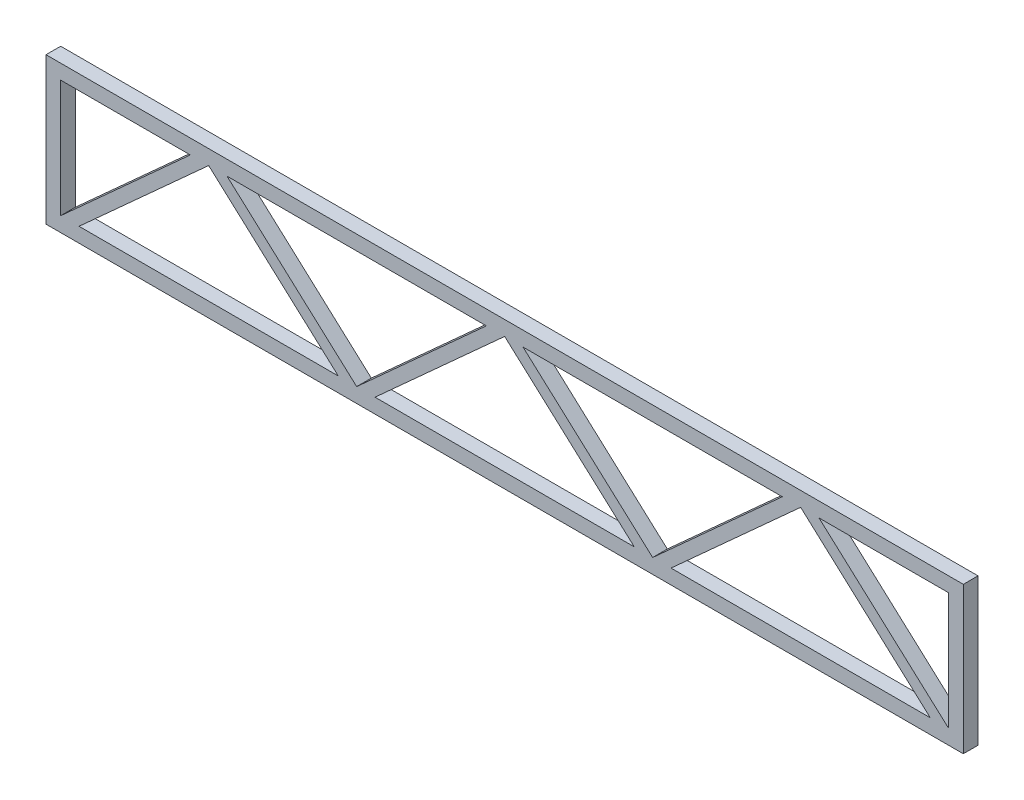
ISO-10303-21;
HEADER;
FILE_DESCRIPTION(('STEP AP214'),'2;1');
FILE_NAME('part.step','',(''),(''),'','','');
FILE_SCHEMA(('AUTOMOTIVE_DESIGN { 1 0 10303 214 1 1 1 1 }'));
ENDSEC;
DATA;
#1=APPLICATION_CONTEXT('core data for automotive mechanical design processes');
#2=APPLICATION_PROTOCOL_DEFINITION('international standard','automotive_design',2000,#1);
#3=PRODUCT_CONTEXT('',#1,'mechanical');
#4=PRODUCT('Part','Part','',(#3));
#5=PRODUCT_RELATED_PRODUCT_CATEGORY('part','',(#4));
#6=PRODUCT_DEFINITION_FORMATION('','',#4);
#7=PRODUCT_DEFINITION_CONTEXT('part definition',#1,'design');
#8=PRODUCT_DEFINITION('design','',#6,#7);
#9=PRODUCT_DEFINITION_SHAPE('','',#8);
#10=(LENGTH_UNIT() NAMED_UNIT(*) SI_UNIT(.MILLI.,.METRE.));
#11=(NAMED_UNIT(*) PLANE_ANGLE_UNIT() SI_UNIT($,.RADIAN.));
#12=(NAMED_UNIT(*) SI_UNIT($,.STERADIAN.) SOLID_ANGLE_UNIT());
#13=UNCERTAINTY_MEASURE_WITH_UNIT(LENGTH_MEASURE(1.E-05),#10,'distance_accuracy_value','');
#14=(GEOMETRIC_REPRESENTATION_CONTEXT(3) GLOBAL_UNCERTAINTY_ASSIGNED_CONTEXT((#13)) GLOBAL_UNIT_ASSIGNED_CONTEXT((#10,
#11,#12)) REPRESENTATION_CONTEXT('',''));
#15=CARTESIAN_POINT('',(0.,0.,0.));
#16=DIRECTION('',(0.,0.,1.));
#17=DIRECTION('',(1.,0.,0.));
#18=AXIS2_PLACEMENT_3D('',#15,#16,#17);
#19=CARTESIAN_POINT('',(125.,0.,3.99999999999999));
#20=DIRECTION('',(1.,0.,0.));
#21=DIRECTION('',(0.,1.,0.));
#22=AXIS2_PLACEMENT_3D('',#19,#20,#21);
#23=PLANE('',#22);
#24=DIRECTION('',(0.,-0.999999999999993,0.));
#25=VECTOR('',#24,1.);
#26=CARTESIAN_POINT('',(125.,0.,0.));
#27=LINE('',#26,#25);
#28=CARTESIAN_POINT('',(125.,20.,0.));
#29=VERTEX_POINT('',#28);
#30=CARTESIAN_POINT('',(125.,-20.,0.));
#31=VERTEX_POINT('',#30);
#32=EDGE_CURVE('E295',#29,#31,#27,.T.);
#33=ORIENTED_EDGE('',*,*,#32,.F.);
#34=DIRECTION('',(0.,0.,-1.));
#35=VECTOR('',#34,1.);
#36=CARTESIAN_POINT('',(125.,20.,3.99999999999999));
#37=LINE('',#36,#35);
#38=CARTESIAN_POINT('',(125.,20.,3.99999999999999));
#39=VERTEX_POINT('',#38);
#40=EDGE_CURVE('E11',#39,#29,#37,.T.);
#41=ORIENTED_EDGE('',*,*,#40,.F.);
#42=DIRECTION('',(0.,-0.999999999999993,0.));
#43=VECTOR('',#42,1.);
#44=CARTESIAN_POINT('',(125.,0.,3.99999999999999));
#45=LINE('',#44,#43);
#46=CARTESIAN_POINT('',(125.,-20.,4.));
#47=VERTEX_POINT('',#46);
#48=EDGE_CURVE('E236',#39,#47,#45,.T.);
#49=ORIENTED_EDGE('',*,*,#48,.T.);
#50=DIRECTION('',(0.,0.,-1.));
#51=VECTOR('',#50,1.);
#52=CARTESIAN_POINT('',(125.,-20.,4.));
#53=LINE('',#52,#51);
#54=EDGE_CURVE('E146',#47,#31,#53,.T.);
#55=ORIENTED_EDGE('',*,*,#54,.T.);
#56=EDGE_LOOP('',(#33,#41,#49,#55));
#57=FACE_BOUND('',#56,.T.);
#58=ADVANCED_FACE('F41',(#57),#23,.T.);
#59=CARTESIAN_POINT('',(0.,20.,4.00000000000001));
#60=DIRECTION('',(0.,1.,0.));
#61=DIRECTION('',(-1.,0.,0.));
#62=AXIS2_PLACEMENT_3D('',#59,#60,#61);
#63=PLANE('',#62);
#64=DIRECTION('',(0.999999999999998,0.,0.));
#65=VECTOR('',#64,1.);
#66=CARTESIAN_POINT('',(0.,20.,0.));
#67=LINE('',#66,#65);
#68=CARTESIAN_POINT('',(-125.,20.,0.));
#69=VERTEX_POINT('',#68);
#70=EDGE_CURVE('E226',#69,#29,#67,.T.);
#71=ORIENTED_EDGE('',*,*,#70,.F.);
#72=DIRECTION('',(0.,0.,-1.));
#73=VECTOR('',#72,1.);
#74=CARTESIAN_POINT('',(-125.,20.,4.));
#75=LINE('',#74,#73);
#76=CARTESIAN_POINT('',(-125.,20.,4.));
#77=VERTEX_POINT('',#76);
#78=EDGE_CURVE('E51',#77,#69,#75,.T.);
#79=ORIENTED_EDGE('',*,*,#78,.F.);
#80=DIRECTION('',(0.999999999999998,0.,0.));
#81=VECTOR('',#80,1.);
#82=CARTESIAN_POINT('',(0.,20.,4.00000000000001));
#83=LINE('',#82,#81);
#84=EDGE_CURVE('E224',#77,#39,#83,.T.);
#85=ORIENTED_EDGE('',*,*,#84,.T.);
#86=ORIENTED_EDGE('',*,*,#40,.T.);
#87=EDGE_LOOP('',(#71,#79,#85,#86));
#88=FACE_BOUND('',#87,.T.);
#89=ADVANCED_FACE('F222',(#88),#63,.T.);
#90=CARTESIAN_POINT('',(-125.,0.,4.));
#91=DIRECTION('',(1.,0.,0.));
#92=DIRECTION('',(0.,1.,0.));
#93=AXIS2_PLACEMENT_3D('',#90,#91,#92);
#94=PLANE('',#93);
#95=DIRECTION('',(0.,-0.999999999999993,0.));
#96=VECTOR('',#95,1.);
#97=CARTESIAN_POINT('',(-125.,0.,0.));
#98=LINE('',#97,#96);
#99=CARTESIAN_POINT('',(-125.,-20.,0.));
#100=VERTEX_POINT('',#99);
#101=EDGE_CURVE('E298',#69,#100,#98,.T.);
#102=ORIENTED_EDGE('',*,*,#101,.T.);
#103=DIRECTION('',(0.,0.,-1.));
#104=VECTOR('',#103,1.);
#105=CARTESIAN_POINT('',(-125.,-20.,4.));
#106=LINE('',#105,#104);
#107=CARTESIAN_POINT('',(-125.,-20.,4.));
#108=VERTEX_POINT('',#107);
#109=EDGE_CURVE('E229',#108,#100,#106,.T.);
#110=ORIENTED_EDGE('',*,*,#109,.F.);
#111=DIRECTION('',(0.,-0.999999999999993,0.));
#112=VECTOR('',#111,1.);
#113=CARTESIAN_POINT('',(-125.,0.,4.));
#114=LINE('',#113,#112);
#115=EDGE_CURVE('E232',#77,#108,#114,.T.);
#116=ORIENTED_EDGE('',*,*,#115,.F.);
#117=ORIENTED_EDGE('',*,*,#78,.T.);
#118=EDGE_LOOP('',(#102,#110,#116,#117));
#119=FACE_BOUND('',#118,.T.);
#120=ADVANCED_FACE('F233',(#119),#94,.F.);
#121=CARTESIAN_POINT('',(-121.,0.,4.00000000000005));
#122=DIRECTION('',(1.,0.,0.));
#123=DIRECTION('',(0.,1.,0.));
#124=AXIS2_PLACEMENT_3D('',#121,#122,#123);
#125=PLANE('',#124);
#126=DIRECTION('',(0.,-0.999999999999993,0.));
#127=VECTOR('',#126,1.);
#128=CARTESIAN_POINT('',(-121.,0.,0.));
#129=LINE('',#128,#127);
#130=CARTESIAN_POINT('',(-121.,16.,0.));
#131=VERTEX_POINT('',#130);
#132=CARTESIAN_POINT('',(-121.,-16.,6.07153216591882E-13));
#133=VERTEX_POINT('',#132);
#134=EDGE_CURVE('E289',#131,#133,#129,.T.);
#135=ORIENTED_EDGE('',*,*,#134,.F.);
#136=DIRECTION('',(0.,0.,-1.));
#137=VECTOR('',#136,1.);
#138=CARTESIAN_POINT('',(-121.,16.,4.00000000000009));
#139=LINE('',#138,#137);
#140=CARTESIAN_POINT('',(-121.,16.,4.00000000000009));
#141=VERTEX_POINT('',#140);
#142=EDGE_CURVE('E303',#141,#131,#139,.T.);
#143=ORIENTED_EDGE('',*,*,#142,.F.);
#144=DIRECTION('',(0.,-0.999999999999993,0.));
#145=VECTOR('',#144,1.);
#146=CARTESIAN_POINT('',(-121.,0.,4.00000000000005));
#147=LINE('',#146,#145);
#148=CARTESIAN_POINT('',(-121.,-16.,4.00000000000061));
#149=VERTEX_POINT('',#148);
#150=EDGE_CURVE('E404',#141,#149,#147,.T.);
#151=ORIENTED_EDGE('',*,*,#150,.T.);
#152=DIRECTION('',(0.,0.,-1.));
#153=VECTOR('',#152,1.);
#154=CARTESIAN_POINT('',(-121.,-16.,4.00000000000061));
#155=LINE('',#154,#153);
#156=EDGE_CURVE('E305',#149,#133,#155,.T.);
#157=ORIENTED_EDGE('',*,*,#156,.T.);
#158=EDGE_LOOP('',(#135,#143,#151,#157));
#159=FACE_BOUND('',#158,.T.);
#160=ADVANCED_FACE('F448',(#159),#125,.T.);
#161=CARTESIAN_POINT('',(0.,16.,4.00000000000001));
#162=DIRECTION('',(0.,1.,0.));
#163=DIRECTION('',(-1.,0.,0.));
#164=AXIS2_PLACEMENT_3D('',#161,#162,#163);
#165=PLANE('',#164);
#166=DIRECTION('',(0.999999999999998,0.,0.));
#167=VECTOR('',#166,1.);
#168=CARTESIAN_POINT('',(0.,16.,0.));
#169=LINE('',#168,#167);
#170=CARTESIAN_POINT('',(-85.6666666666664,16.,2.62854552938544E-13));
#171=VERTEX_POINT('',#170);
#172=EDGE_CURVE('E262',#131,#171,#169,.T.);
#173=ORIENTED_EDGE('',*,*,#172,.T.);
#174=DIRECTION('',(0.,0.,-1.));
#175=VECTOR('',#174,1.);
#176=CARTESIAN_POINT('',(-85.6666666666664,16.,4.00000000000026));
#177=LINE('',#176,#175);
#178=CARTESIAN_POINT('',(-85.6666666666664,16.,4.00000000000026));
#179=VERTEX_POINT('',#178);
#180=EDGE_CURVE('E307',#179,#171,#177,.T.);
#181=ORIENTED_EDGE('',*,*,#180,.F.);
#182=DIRECTION('',(0.999999999999998,0.,0.));
#183=VECTOR('',#182,1.);
#184=CARTESIAN_POINT('',(0.,16.,4.00000000000001));
#185=LINE('',#184,#183);
#186=EDGE_CURVE('E406',#141,#179,#185,.T.);
#187=ORIENTED_EDGE('',*,*,#186,.F.);
#188=ORIENTED_EDGE('',*,*,#142,.T.);
#189=EDGE_LOOP('',(#173,#181,#187,#188));
#190=FACE_BOUND('',#189,.T.);
#191=ADVANCED_FACE('F442',(#190),#165,.F.);
#192=CARTESIAN_POINT('',(46.5636612556236,51.4140426364171,4.));
#193=DIRECTION('',(-0.67127943262646,-0.741204373525074,0.));
#194=DIRECTION('',(0.741204373525074,-0.67127943262646,0.));
#195=AXIS2_PLACEMENT_3D('',#192,#193,#194);
#196=PLANE('',#195);
#197=DIRECTION('',(-0.741204373525059,0.671279432626446,0.));
#198=VECTOR('',#197,1.);
#199=CARTESIAN_POINT('',(46.5636612556236,51.4140426364171,0.));
#200=LINE('',#199,#198);
#201=CARTESIAN_POINT('',(120.999999999998,-16.,-4.75314232417645E-13));
#202=VERTEX_POINT('',#201);
#203=CARTESIAN_POINT('',(85.6666666666667,16.,0.));
#204=VERTEX_POINT('',#203);
#205=EDGE_CURVE('E283',#202,#204,#200,.T.);
#206=ORIENTED_EDGE('',*,*,#205,.T.);
#207=DIRECTION('',(0.,0.,-1.));
#208=VECTOR('',#207,1.);
#209=CARTESIAN_POINT('',(85.6666666666667,16.,3.99999999999993));
#210=LINE('',#209,#208);
#211=CARTESIAN_POINT('',(85.6666666666667,16.,3.99999999999993));
#212=VERTEX_POINT('',#211);
#213=EDGE_CURVE('E308',#212,#204,#210,.T.);
#214=ORIENTED_EDGE('',*,*,#213,.F.);
#215=DIRECTION('',(-0.741204373525059,0.671279432626446,0.));
#216=VECTOR('',#215,1.);
#217=CARTESIAN_POINT('',(46.5636612556236,51.4140426364171,4.));
#218=LINE('',#217,#216);
#219=CARTESIAN_POINT('',(120.999999999998,-16.,3.99999999999952));
#220=VERTEX_POINT('',#219);
#221=EDGE_CURVE('E373',#220,#212,#218,.T.);
#222=ORIENTED_EDGE('',*,*,#221,.F.);
#223=DIRECTION('',(0.,0.,-1.));
#224=VECTOR('',#223,1.);
#225=CARTESIAN_POINT('',(120.999999999998,-16.,3.99999999999952));
#226=LINE('',#225,#224);
#227=EDGE_CURVE('E311',#220,#202,#226,.T.);
#228=ORIENTED_EDGE('',*,*,#227,.T.);
#229=EDGE_LOOP('',(#206,#214,#222,#228));
#230=FACE_BOUND('',#229,.T.);
#231=ADVANCED_FACE('F472',(#230),#196,.F.);
#232=CARTESIAN_POINT('',(121.,16.,0.));
#233=VERTEX_POINT('',#232);
#234=EDGE_CURVE('E286',#204,#233,#169,.T.);
#235=ORIENTED_EDGE('',*,*,#234,.T.);
#236=DIRECTION('',(0.,0.,-1.));
#237=VECTOR('',#236,1.);
#238=CARTESIAN_POINT('',(121.,16.,3.9999999999999));
#239=LINE('',#238,#237);
#240=CARTESIAN_POINT('',(121.,16.,3.9999999999999));
#241=VERTEX_POINT('',#240);
#242=EDGE_CURVE('E314',#241,#233,#239,.T.);
#243=ORIENTED_EDGE('',*,*,#242,.F.);
#244=EDGE_CURVE('E401',#212,#241,#185,.T.);
#245=ORIENTED_EDGE('',*,*,#244,.F.);
#246=ORIENTED_EDGE('',*,*,#213,.T.);
#247=EDGE_LOOP('',(#235,#243,#245,#246));
#248=FACE_BOUND('',#247,.T.);
#249=ADVANCED_FACE('F474',(#248),#165,.F.);
#250=CARTESIAN_POINT('',(28.3888128300409,-31.34598083317,3.99999999999992));
#251=DIRECTION('',(0.671279432626451,-0.741204373525083,0.));
#252=DIRECTION('',(0.741204373525083,0.671279432626451,0.));
#253=AXIS2_PLACEMENT_3D('',#250,#251,#252);
#254=PLANE('',#253);
#255=DIRECTION('',(-0.74120437352501,-0.671279432626385,0.));
#256=VECTOR('',#255,1.);
#257=CARTESIAN_POINT('',(28.3888128300409,-31.34598083317,0.));
#258=LINE('',#257,#256);
#259=CARTESIAN_POINT('',(80.6666666666656,16.,0.));
#260=VERTEX_POINT('',#259);
#261=CARTESIAN_POINT('',(45.3333333333326,-16.,0.));
#262=VERTEX_POINT('',#261);
#263=EDGE_CURVE('E277',#260,#262,#258,.T.);
#264=ORIENTED_EDGE('',*,*,#263,.F.);
#265=DIRECTION('',(0.,0.,-1.));
#266=VECTOR('',#265,1.);
#267=CARTESIAN_POINT('',(80.6666666666656,16.,3.99999999999994));
#268=LINE('',#267,#266);
#269=CARTESIAN_POINT('',(80.6666666666656,16.,3.99999999999994));
#270=VERTEX_POINT('',#269);
#271=EDGE_CURVE('E315',#270,#260,#268,.T.);
#272=ORIENTED_EDGE('',*,*,#271,.F.);
#273=DIRECTION('',(-0.74120437352501,-0.671279432626385,0.));
#274=VECTOR('',#273,1.);
#275=CARTESIAN_POINT('',(28.3888128300409,-31.34598083317,3.99999999999992));
#276=LINE('',#275,#274);
#277=CARTESIAN_POINT('',(45.3333333333326,-16.,3.99999999999993));
#278=VERTEX_POINT('',#277);
#279=EDGE_CURVE('E394',#270,#278,#276,.T.);
#280=ORIENTED_EDGE('',*,*,#279,.T.);
#281=DIRECTION('',(0.,0.,-1.));
#282=VECTOR('',#281,1.);
#283=CARTESIAN_POINT('',(45.3333333333326,-16.,3.99999999999993));
#284=LINE('',#283,#282);
#285=EDGE_CURVE('E320',#278,#262,#284,.T.);
#286=ORIENTED_EDGE('',*,*,#285,.T.);
#287=EDGE_LOOP('',(#264,#272,#280,#286));
#288=FACE_BOUND('',#287,.T.);
#289=ADVANCED_FACE('F491',(#288),#254,.T.);
#290=CARTESIAN_POINT('',(44.3105808722854,48.9262663798165,3.99999999999996));
#291=DIRECTION('',(-0.67127943262645,-0.741204373525083,0.));
#292=DIRECTION('',(0.741204373525083,-0.67127943262645,0.));
#293=AXIS2_PLACEMENT_3D('',#290,#291,#292);
#294=PLANE('',#293);
#295=DIRECTION('',(-0.741204373525068,0.671279432626437,0.));
#296=VECTOR('',#295,1.);
#297=CARTESIAN_POINT('',(44.3105808722854,48.9262663798165,0.));
#298=LINE('',#297,#296);
#299=CARTESIAN_POINT('',(116.,-16.,-1.12215792213988E-13));
#300=VERTEX_POINT('',#299);
#301=EDGE_CURVE('E280',#300,#260,#298,.T.);
#302=ORIENTED_EDGE('',*,*,#301,.F.);
#303=DIRECTION('',(0.,0.,-1.));
#304=VECTOR('',#303,1.);
#305=CARTESIAN_POINT('',(116.,-16.,3.99999999999989));
#306=LINE('',#305,#304);
#307=CARTESIAN_POINT('',(116.,-16.,3.99999999999989));
#308=VERTEX_POINT('',#307);
#309=EDGE_CURVE('E322',#308,#300,#306,.T.);
#310=ORIENTED_EDGE('',*,*,#309,.F.);
#311=DIRECTION('',(-0.741204373525068,0.671279432626437,0.));
#312=VECTOR('',#311,1.);
#313=CARTESIAN_POINT('',(44.3105808722854,48.9262663798165,3.99999999999996));
#314=LINE('',#313,#312);
#315=EDGE_CURVE('E374',#308,#270,#314,.T.);
#316=ORIENTED_EDGE('',*,*,#315,.T.);
#317=ORIENTED_EDGE('',*,*,#271,.T.);
#318=EDGE_LOOP('',(#302,#310,#316,#317));
#319=FACE_BOUND('',#318,.T.);
#320=ADVANCED_FACE('F488',(#319),#294,.T.);
#321=CARTESIAN_POINT('',(10.2139644044591,11.2779190299237,3.99999999999999));
#322=DIRECTION('',(-0.67127943262642,-0.74120437352511,0.));
#323=DIRECTION('',(0.74120437352511,-0.67127943262642,0.));
#324=AXIS2_PLACEMENT_3D('',#321,#322,#323);
#325=PLANE('',#324);
#326=DIRECTION('',(-0.741204373525068,0.671279432626381,0.));
#327=VECTOR('',#326,1.);
#328=CARTESIAN_POINT('',(10.2139644044591,11.2779190299237,0.));
#329=LINE('',#328,#327);
#330=CARTESIAN_POINT('',(40.3333333333326,-16.,-2.54000524317158E-13));
#331=VERTEX_POINT('',#330);
#332=CARTESIAN_POINT('',(4.99999999999975,16.,0.));
#333=VERTEX_POINT('',#332);
#334=EDGE_CURVE('E272',#331,#333,#329,.T.);
#335=ORIENTED_EDGE('',*,*,#334,.T.);
#336=DIRECTION('',(0.,0.,-1.));
#337=VECTOR('',#336,1.);
#338=CARTESIAN_POINT('',(4.99999999999975,16.,3.99999999999999));
#339=LINE('',#338,#337);
#340=CARTESIAN_POINT('',(4.99999999999975,16.,3.99999999999999));
#341=VERTEX_POINT('',#340);
#342=EDGE_CURVE('E323',#341,#333,#339,.T.);
#343=ORIENTED_EDGE('',*,*,#342,.F.);
#344=DIRECTION('',(-0.741204373525068,0.671279432626381,0.));
#345=VECTOR('',#344,1.);
#346=CARTESIAN_POINT('',(10.2139644044591,11.2779190299237,3.99999999999999));
#347=LINE('',#346,#345);
#348=CARTESIAN_POINT('',(40.3333333333326,-16.,3.99999999999975));
#349=VERTEX_POINT('',#348);
#350=EDGE_CURVE('E376',#349,#341,#347,.T.);
#351=ORIENTED_EDGE('',*,*,#350,.F.);
#352=DIRECTION('',(0.,0.,-1.));
#353=VECTOR('',#352,1.);
#354=CARTESIAN_POINT('',(40.3333333333326,-16.,3.99999999999975));
#355=LINE('',#354,#353);
#356=EDGE_CURVE('E326',#349,#331,#355,.T.);
#357=ORIENTED_EDGE('',*,*,#356,.T.);
#358=EDGE_LOOP('',(#335,#343,#351,#357));
#359=FACE_BOUND('',#358,.T.);
#360=ADVANCED_FACE('F434',(#359),#325,.F.);
#361=CARTESIAN_POINT('',(75.6666666666655,16.,0.));
#362=VERTEX_POINT('',#361);
#363=EDGE_CURVE('E263',#333,#362,#169,.T.);
#364=ORIENTED_EDGE('',*,*,#363,.T.);
#365=DIRECTION('',(0.,0.,-1.));
#366=VECTOR('',#365,1.);
#367=CARTESIAN_POINT('',(75.6666666666655,16.,3.99999999999994));
#368=LINE('',#367,#366);
#369=CARTESIAN_POINT('',(75.6666666666655,16.,3.99999999999994));
#370=VERTEX_POINT('',#369);
#371=EDGE_CURVE('E329',#370,#362,#368,.T.);
#372=ORIENTED_EDGE('',*,*,#371,.F.);
#373=EDGE_CURVE('E381',#341,#370,#185,.T.);
#374=ORIENTED_EDGE('',*,*,#373,.F.);
#375=ORIENTED_EDGE('',*,*,#342,.T.);
#376=EDGE_LOOP('',(#364,#372,#374,#375));
#377=FACE_BOUND('',#376,.T.);
#378=ADVANCED_FACE('F428',(#377),#165,.F.);
#379=CARTESIAN_POINT('',(-7.96088402112262,8.7901427733228,3.99999999999999));
#380=DIRECTION('',(-0.671279432626461,0.741204373525074,0.));
#381=DIRECTION('',(-0.741204373525074,-0.671279432626461,0.));
#382=AXIS2_PLACEMENT_3D('',#379,#380,#381);
#383=PLANE('',#382);
#384=DIRECTION('',(0.741204373524997,0.671279432626392,0.));
#385=VECTOR('',#384,1.);
#386=CARTESIAN_POINT('',(-7.96088402112262,8.7901427733228,0.));
#387=LINE('',#386,#385);
#388=CARTESIAN_POINT('',(-35.3333333333332,-16.,0.));
#389=VERTEX_POINT('',#388);
#390=CARTESIAN_POINT('',(0.,16.,0.));
#391=VERTEX_POINT('',#390);
#392=EDGE_CURVE('E266',#389,#391,#387,.T.);
#393=ORIENTED_EDGE('',*,*,#392,.T.);
#394=DIRECTION('',(0.,0.,-1.));
#395=VECTOR('',#394,1.);
#396=CARTESIAN_POINT('',(0.,16.,4.00000000000001));
#397=LINE('',#396,#395);
#398=CARTESIAN_POINT('',(0.,16.,4.00000000000001));
#399=VERTEX_POINT('',#398);
#400=EDGE_CURVE('E330',#399,#391,#397,.T.);
#401=ORIENTED_EDGE('',*,*,#400,.F.);
#402=DIRECTION('',(0.741204373524997,0.671279432626392,0.));
#403=VECTOR('',#402,1.);
#404=CARTESIAN_POINT('',(-7.96088402112262,8.7901427733228,3.99999999999999));
#405=LINE('',#404,#403);
#406=CARTESIAN_POINT('',(-35.3333333333332,-16.,4.00000000000003));
#407=VERTEX_POINT('',#406);
#408=EDGE_CURVE('E384',#407,#399,#405,.T.);
#409=ORIENTED_EDGE('',*,*,#408,.F.);
#410=DIRECTION('',(0.,0.,-1.));
#411=VECTOR('',#410,1.);
#412=CARTESIAN_POINT('',(-35.3333333333332,-16.,4.00000000000003));
#413=LINE('',#412,#411);
#414=EDGE_CURVE('E335',#407,#389,#413,.T.);
#415=ORIENTED_EDGE('',*,*,#414,.T.);
#416=EDGE_LOOP('',(#393,#401,#409,#415));
#417=FACE_BOUND('',#416,.T.);
#418=ADVANCED_FACE('F504',(#417),#383,.F.);
#419=CARTESIAN_POINT('',(7.96088402112262,8.79014277332302,3.99999999999999));
#420=DIRECTION('',(-0.671279432626422,-0.741204373525108,0.));
#421=DIRECTION('',(0.741204373525108,-0.671279432626422,0.));
#422=AXIS2_PLACEMENT_3D('',#419,#420,#421);
#423=PLANE('',#422);
#424=DIRECTION('',(-0.741204373525066,0.671279432626383,0.));
#425=VECTOR('',#424,1.);
#426=CARTESIAN_POINT('',(7.96088402112262,8.79014277332302,0.));
#427=LINE('',#426,#425);
#428=CARTESIAN_POINT('',(35.3333333333332,-16.,0.));
#429=VERTEX_POINT('',#428);
#430=EDGE_CURVE('E269',#429,#391,#427,.T.);
#431=ORIENTED_EDGE('',*,*,#430,.F.);
#432=DIRECTION('',(0.,0.,-1.));
#433=VECTOR('',#432,1.);
#434=CARTESIAN_POINT('',(35.3333333333332,-16.,3.99999999999994));
#435=LINE('',#434,#433);
#436=CARTESIAN_POINT('',(35.3333333333332,-16.,3.99999999999994));
#437=VERTEX_POINT('',#436);
#438=EDGE_CURVE('E337',#437,#429,#435,.T.);
#439=ORIENTED_EDGE('',*,*,#438,.F.);
#440=DIRECTION('',(-0.741204373525066,0.671279432626383,0.));
#441=VECTOR('',#440,1.);
#442=CARTESIAN_POINT('',(7.96088402112262,8.79014277332302,3.99999999999999));
#443=LINE('',#442,#441);
#444=EDGE_CURVE('E377',#437,#399,#443,.T.);
#445=ORIENTED_EDGE('',*,*,#444,.T.);
#446=ORIENTED_EDGE('',*,*,#400,.T.);
#447=EDGE_LOOP('',(#431,#439,#445,#446));
#448=FACE_BOUND('',#447,.T.);
#449=ADVANCED_FACE('F500',(#448),#423,.T.);
#450=CARTESIAN_POINT('',(-26.1357324467045,-28.8582045765695,4.));
#451=DIRECTION('',(0.671279432626465,0.74120437352507,0.));
#452=DIRECTION('',(-0.74120437352507,0.671279432626465,0.));
#453=AXIS2_PLACEMENT_3D('',#450,#451,#452);
#454=PLANE('',#453);
#455=DIRECTION('',(0.741204373525063,-0.671279432626458,0.));
#456=VECTOR('',#455,1.);
#457=CARTESIAN_POINT('',(-26.1357324467045,-28.8582045765695,0.));
#458=LINE('',#457,#456);
#459=CARTESIAN_POINT('',(-75.6666666666664,16.,0.));
#460=VERTEX_POINT('',#459);
#461=CARTESIAN_POINT('',(-40.3333333333333,-16.,0.));
#462=VERTEX_POINT('',#461);
#463=EDGE_CURVE('E253',#460,#462,#458,.T.);
#464=ORIENTED_EDGE('',*,*,#463,.F.);
#465=DIRECTION('',(0.,0.,-1.));
#466=VECTOR('',#465,1.);
#467=CARTESIAN_POINT('',(-75.6666666666664,16.,4.00000000000008));
#468=LINE('',#467,#466);
#469=CARTESIAN_POINT('',(-75.6666666666664,16.,4.00000000000008));
#470=VERTEX_POINT('',#469);
#471=EDGE_CURVE('E338',#470,#460,#468,.T.);
#472=ORIENTED_EDGE('',*,*,#471,.F.);
#473=DIRECTION('',(0.741204373525063,-0.671279432626458,0.));
#474=VECTOR('',#473,1.);
#475=CARTESIAN_POINT('',(-26.1357324467045,-28.8582045765695,4.));
#476=LINE('',#475,#474);
#477=CARTESIAN_POINT('',(-40.3333333333333,-16.,4.00000000000002));
#478=VERTEX_POINT('',#477);
#479=EDGE_CURVE('E364',#470,#478,#476,.T.);
#480=ORIENTED_EDGE('',*,*,#479,.T.);
#481=DIRECTION('',(0.,0.,-1.));
#482=VECTOR('',#481,1.);
#483=CARTESIAN_POINT('',(-40.3333333333333,-16.,4.00000000000002));
#484=LINE('',#483,#482);
#485=EDGE_CURVE('E341',#478,#462,#484,.T.);
#486=ORIENTED_EDGE('',*,*,#485,.T.);
#487=EDGE_LOOP('',(#464,#472,#480,#486));
#488=FACE_BOUND('',#487,.T.);
#489=ADVANCED_FACE('F503',(#488),#454,.T.);
#490=CARTESIAN_POINT('',(-4.99999999999997,16.,0.));
#491=VERTEX_POINT('',#490);
#492=EDGE_CURVE('E258',#460,#491,#169,.T.);
#493=ORIENTED_EDGE('',*,*,#492,.T.);
#494=DIRECTION('',(0.,0.,-1.));
#495=VECTOR('',#494,1.);
#496=CARTESIAN_POINT('',(-4.99999999999997,16.,4.00000000000001));
#497=LINE('',#496,#495);
#498=CARTESIAN_POINT('',(-4.99999999999997,16.,4.00000000000001));
#499=VERTEX_POINT('',#498);
#500=EDGE_CURVE('E343',#499,#491,#497,.T.);
#501=ORIENTED_EDGE('',*,*,#500,.F.);
#502=EDGE_CURVE('E369',#470,#499,#185,.T.);
#503=ORIENTED_EDGE('',*,*,#502,.F.);
#504=ORIENTED_EDGE('',*,*,#471,.T.);
#505=EDGE_LOOP('',(#493,#501,#503,#504));
#506=FACE_BOUND('',#505,.T.);
#507=ADVANCED_FACE('F473',(#506),#165,.F.);
#508=CARTESIAN_POINT('',(-44.3105808722863,48.926266379816,4.00000000000001));
#509=DIRECTION('',(-0.671279432626469,0.741204373525067,0.));
#510=DIRECTION('',(-0.741204373525067,-0.671279432626469,0.));
#511=AXIS2_PLACEMENT_3D('',#508,#509,#510);
#512=PLANE('',#511);
#513=DIRECTION('',(0.741204373525059,0.671279432626462,0.));
#514=VECTOR('',#513,1.);
#515=CARTESIAN_POINT('',(-44.3105808722863,48.926266379816,0.));
#516=LINE('',#515,#514);
#517=CARTESIAN_POINT('',(-116.,-16.,3.72424313610508E-13));
#518=VERTEX_POINT('',#517);
#519=CARTESIAN_POINT('',(-80.6666666666665,16.,0.));
#520=VERTEX_POINT('',#519);
#521=EDGE_CURVE('E244',#518,#520,#516,.T.);
#522=ORIENTED_EDGE('',*,*,#521,.T.);
#523=DIRECTION('',(0.,0.,-1.));
#524=VECTOR('',#523,1.);
#525=CARTESIAN_POINT('',(-80.6666666666665,16.,4.00000000000003));
#526=LINE('',#525,#524);
#527=CARTESIAN_POINT('',(-80.6666666666665,16.,4.00000000000003));
#528=VERTEX_POINT('',#527);
#529=EDGE_CURVE('E45',#528,#520,#526,.T.);
#530=ORIENTED_EDGE('',*,*,#529,.F.);
#531=DIRECTION('',(0.741204373525059,0.671279432626462,0.));
#532=VECTOR('',#531,1.);
#533=CARTESIAN_POINT('',(-44.3105808722863,48.926266379816,4.00000000000001));
#534=LINE('',#533,#532);
#535=CARTESIAN_POINT('',(-116.,-16.,4.00000000000037));
#536=VERTEX_POINT('',#535);
#537=EDGE_CURVE('E301',#536,#528,#534,.T.);
#538=ORIENTED_EDGE('',*,*,#537,.F.);
#539=DIRECTION('',(0.,0.,-1.));
#540=VECTOR('',#539,1.);
#541=CARTESIAN_POINT('',(-116.,-16.,4.00000000000037));
#542=LINE('',#541,#540);
#543=EDGE_CURVE('E243',#536,#518,#542,.T.);
#544=ORIENTED_EDGE('',*,*,#543,.T.);
#545=EDGE_LOOP('',(#522,#530,#538,#544));
#546=FACE_BOUND('',#545,.T.);
#547=ADVANCED_FACE('F43',(#546),#512,.F.);
#548=CARTESIAN_POINT('',(-28.3888128300414,-31.3459808331704,3.99999999999997));
#549=DIRECTION('',(0.671279432626465,0.74120437352507,0.));
#550=DIRECTION('',(-0.74120437352507,0.671279432626465,0.));
#551=AXIS2_PLACEMENT_3D('',#548,#549,#550);
#552=PLANE('',#551);
#553=DIRECTION('',(0.741204373525063,-0.671279432626458,0.));
#554=VECTOR('',#553,1.);
#555=CARTESIAN_POINT('',(-28.3888128300414,-31.3459808331704,0.));
#556=LINE('',#555,#554);
#557=CARTESIAN_POINT('',(-45.3333333333331,-16.,0.));
#558=VERTEX_POINT('',#557);
#559=EDGE_CURVE('E247',#520,#558,#556,.T.);
#560=ORIENTED_EDGE('',*,*,#559,.T.);
#561=DIRECTION('',(0.,0.,-1.));
#562=VECTOR('',#561,1.);
#563=CARTESIAN_POINT('',(-45.3333333333331,-16.,4.00000000000003));
#564=LINE('',#563,#562);
#565=CARTESIAN_POINT('',(-45.3333333333331,-16.,4.00000000000003));
#566=VERTEX_POINT('',#565);
#567=EDGE_CURVE('E346',#566,#558,#564,.T.);
#568=ORIENTED_EDGE('',*,*,#567,.F.);
#569=DIRECTION('',(0.741204373525063,-0.671279432626458,0.));
#570=VECTOR('',#569,1.);
#571=CARTESIAN_POINT('',(-28.3888128300414,-31.3459808331704,3.99999999999997));
#572=LINE('',#571,#570);
#573=EDGE_CURVE('E154',#528,#566,#572,.T.);
#574=ORIENTED_EDGE('',*,*,#573,.F.);
#575=ORIENTED_EDGE('',*,*,#529,.T.);
#576=EDGE_LOOP('',(#560,#568,#574,#575));
#577=FACE_BOUND('',#576,.T.);
#578=ADVANCED_FACE('F351',(#577),#552,.F.);
#579=CARTESIAN_POINT('',(-46.5636612556229,51.4140426364169,3.99999999999999));
#580=DIRECTION('',(-0.671279432626469,0.741204373525067,0.));
#581=DIRECTION('',(-0.741204373525067,-0.671279432626469,0.));
#582=AXIS2_PLACEMENT_3D('',#579,#580,#581);
#583=PLANE('',#582);
#584=DIRECTION('',(0.741204373525059,0.671279432626462,0.));
#585=VECTOR('',#584,1.);
#586=CARTESIAN_POINT('',(-46.5636612556229,51.4140426364169,0.));
#587=LINE('',#586,#585);
#588=EDGE_CURVE('E292',#133,#171,#587,.T.);
#589=ORIENTED_EDGE('',*,*,#588,.F.);
#590=ORIENTED_EDGE('',*,*,#156,.F.);
#591=DIRECTION('',(0.741204373525059,0.671279432626462,0.));
#592=VECTOR('',#591,1.);
#593=CARTESIAN_POINT('',(-46.5636612556229,51.4140426364169,3.99999999999999));
#594=LINE('',#593,#592);
#595=EDGE_CURVE('E238',#149,#179,#594,.T.);
#596=ORIENTED_EDGE('',*,*,#595,.T.);
#597=ORIENTED_EDGE('',*,*,#180,.T.);
#598=EDGE_LOOP('',(#589,#590,#596,#597));
#599=FACE_BOUND('',#598,.T.);
#600=ADVANCED_FACE('F446',(#599),#583,.T.);
#601=CARTESIAN_POINT('',(121.,0.,3.9999999999999));
#602=DIRECTION('',(1.,0.,0.));
#603=DIRECTION('',(0.,1.,0.));
#604=AXIS2_PLACEMENT_3D('',#601,#602,#603);
#605=PLANE('',#604);
#606=DIRECTION('',(0.,-0.999999999999993,0.));
#607=VECTOR('',#606,1.);
#608=CARTESIAN_POINT('',(121.,0.,0.));
#609=LINE('',#608,#607);
#610=EDGE_CURVE('E287',#233,#202,#609,.T.);
#611=ORIENTED_EDGE('',*,*,#610,.T.);
#612=ORIENTED_EDGE('',*,*,#227,.F.);
#613=DIRECTION('',(0.,-0.999999999999993,0.));
#614=VECTOR('',#613,1.);
#615=CARTESIAN_POINT('',(121.,0.,3.9999999999999));
#616=LINE('',#615,#614);
#617=EDGE_CURVE('E402',#241,#220,#616,.T.);
#618=ORIENTED_EDGE('',*,*,#617,.F.);
#619=ORIENTED_EDGE('',*,*,#242,.T.);
#620=EDGE_LOOP('',(#611,#612,#618,#619));
#621=FACE_BOUND('',#620,.T.);
#622=ADVANCED_FACE('F469',(#621),#605,.F.);
#623=CARTESIAN_POINT('',(0.,-16.,4.));
#624=DIRECTION('',(0.,1.,0.));
#625=DIRECTION('',(-1.,0.,0.));
#626=AXIS2_PLACEMENT_3D('',#623,#624,#625);
#627=PLANE('',#626);
#628=DIRECTION('',(0.999999999999998,0.,0.));
#629=VECTOR('',#628,1.);
#630=CARTESIAN_POINT('',(0.,-16.,0.));
#631=LINE('',#630,#629);
#632=EDGE_CURVE('E254',#262,#300,#631,.T.);
#633=ORIENTED_EDGE('',*,*,#632,.F.);
#634=ORIENTED_EDGE('',*,*,#285,.F.);
#635=DIRECTION('',(0.999999999999998,0.,0.));
#636=VECTOR('',#635,1.);
#637=CARTESIAN_POINT('',(0.,-16.,4.));
#638=LINE('',#637,#636);
#639=EDGE_CURVE('E366',#278,#308,#638,.T.);
#640=ORIENTED_EDGE('',*,*,#639,.T.);
#641=ORIENTED_EDGE('',*,*,#309,.T.);
#642=EDGE_LOOP('',(#633,#634,#640,#641));
#643=FACE_BOUND('',#642,.T.);
#644=ADVANCED_FACE('F479',(#643),#627,.T.);
#645=CARTESIAN_POINT('',(26.1357324467044,-28.8582045765693,3.99999999999993));
#646=DIRECTION('',(0.671279432626451,-0.741204373525082,0.));
#647=DIRECTION('',(0.741204373525082,0.671279432626451,0.));
#648=AXIS2_PLACEMENT_3D('',#645,#646,#647);
#649=PLANE('',#648);
#650=DIRECTION('',(-0.74120437352501,-0.671279432626386,0.));
#651=VECTOR('',#650,1.);
#652=CARTESIAN_POINT('',(26.1357324467044,-28.8582045765693,0.));
#653=LINE('',#652,#651);
#654=EDGE_CURVE('E275',#362,#331,#653,.T.);
#655=ORIENTED_EDGE('',*,*,#654,.T.);
#656=ORIENTED_EDGE('',*,*,#356,.F.);
#657=DIRECTION('',(-0.74120437352501,-0.671279432626386,0.));
#658=VECTOR('',#657,1.);
#659=CARTESIAN_POINT('',(26.1357324467044,-28.8582045765693,3.99999999999993));
#660=LINE('',#659,#658);
#661=EDGE_CURVE('E392',#370,#349,#660,.T.);
#662=ORIENTED_EDGE('',*,*,#661,.F.);
#663=ORIENTED_EDGE('',*,*,#371,.T.);
#664=EDGE_LOOP('',(#655,#656,#662,#663));
#665=FACE_BOUND('',#664,.T.);
#666=ADVANCED_FACE('F431',(#665),#649,.F.);
#667=EDGE_CURVE('E255',#389,#429,#631,.T.);
#668=ORIENTED_EDGE('',*,*,#667,.F.);
#669=ORIENTED_EDGE('',*,*,#414,.F.);
#670=EDGE_CURVE('E367',#407,#437,#638,.T.);
#671=ORIENTED_EDGE('',*,*,#670,.T.);
#672=ORIENTED_EDGE('',*,*,#438,.T.);
#673=EDGE_LOOP('',(#668,#669,#671,#672));
#674=FACE_BOUND('',#673,.T.);
#675=ADVANCED_FACE('F487',(#674),#627,.T.);
#676=CARTESIAN_POINT('',(-10.2139644044592,11.2779190299237,3.99999999999999));
#677=DIRECTION('',(-0.671279432626461,0.741204373525074,0.));
#678=DIRECTION('',(-0.741204373525074,-0.671279432626461,0.));
#679=AXIS2_PLACEMENT_3D('',#676,#677,#678);
#680=PLANE('',#679);
#681=DIRECTION('',(0.741204373524997,0.671279432626392,0.));
#682=VECTOR('',#681,1.);
#683=CARTESIAN_POINT('',(-10.2139644044592,11.2779190299237,0.));
#684=LINE('',#683,#682);
#685=EDGE_CURVE('E261',#462,#491,#684,.T.);
#686=ORIENTED_EDGE('',*,*,#685,.F.);
#687=ORIENTED_EDGE('',*,*,#485,.F.);
#688=DIRECTION('',(0.741204373524997,0.671279432626392,0.));
#689=VECTOR('',#688,1.);
#690=CARTESIAN_POINT('',(-10.2139644044592,11.2779190299237,3.99999999999999));
#691=LINE('',#690,#689);
#692=EDGE_CURVE('E388',#478,#499,#691,.T.);
#693=ORIENTED_EDGE('',*,*,#692,.T.);
#694=ORIENTED_EDGE('',*,*,#500,.T.);
#695=EDGE_LOOP('',(#686,#687,#693,#694));
#696=FACE_BOUND('',#695,.T.);
#697=ADVANCED_FACE('F508',(#696),#680,.T.);
#698=EDGE_CURVE('E250',#518,#558,#631,.T.);
#699=ORIENTED_EDGE('',*,*,#698,.F.);
#700=ORIENTED_EDGE('',*,*,#543,.F.);
#701=EDGE_CURVE('E360',#536,#566,#638,.T.);
#702=ORIENTED_EDGE('',*,*,#701,.T.);
#703=ORIENTED_EDGE('',*,*,#567,.T.);
#704=EDGE_LOOP('',(#699,#700,#702,#703));
#705=FACE_BOUND('',#704,.T.);
#706=ADVANCED_FACE('F358',(#705),#627,.T.);
#707=CARTESIAN_POINT('',(0.,-20.,4.));
#708=DIRECTION('',(0.,1.,0.));
#709=DIRECTION('',(-1.,0.,0.));
#710=AXIS2_PLACEMENT_3D('',#707,#708,#709);
#711=PLANE('',#710);
#712=DIRECTION('',(0.999999999999998,0.,0.));
#713=VECTOR('',#712,1.);
#714=CARTESIAN_POINT('',(0.,-20.,0.));
#715=LINE('',#714,#713);
#716=EDGE_CURVE('E139',#100,#31,#715,.T.);
#717=ORIENTED_EDGE('',*,*,#716,.T.);
#718=ORIENTED_EDGE('',*,*,#54,.F.);
#719=DIRECTION('',(0.999999999999998,0.,0.));
#720=VECTOR('',#719,1.);
#721=CARTESIAN_POINT('',(0.,-20.,4.));
#722=LINE('',#721,#720);
#723=EDGE_CURVE('E60',#108,#47,#722,.T.);
#724=ORIENTED_EDGE('',*,*,#723,.F.);
#725=ORIENTED_EDGE('',*,*,#109,.T.);
#726=EDGE_LOOP('',(#717,#718,#724,#725));
#727=FACE_BOUND('',#726,.T.);
#728=ADVANCED_FACE('F450',(#727),#711,.F.);
#729=CARTESIAN_POINT('',(0.,0.,4.));
#730=DIRECTION('',(0.,0.,0.999999999999995));
#731=DIRECTION('',(0.999999999999998,0.,0.));
#732=AXIS2_PLACEMENT_3D('',#729,#730,#731);
#733=PLANE('',#732);
#734=ORIENTED_EDGE('',*,*,#537,.T.);
#735=ORIENTED_EDGE('',*,*,#573,.T.);
#736=ORIENTED_EDGE('',*,*,#701,.F.);
#737=EDGE_LOOP('',(#734,#735,#736));
#738=FACE_BOUND('',#737,.T.);
#739=ORIENTED_EDGE('',*,*,#479,.F.);
#740=ORIENTED_EDGE('',*,*,#502,.T.);
#741=ORIENTED_EDGE('',*,*,#692,.F.);
#742=EDGE_LOOP('',(#739,#740,#741));
#743=FACE_BOUND('',#742,.T.);
#744=ORIENTED_EDGE('',*,*,#408,.T.);
#745=ORIENTED_EDGE('',*,*,#444,.F.);
#746=ORIENTED_EDGE('',*,*,#670,.F.);
#747=EDGE_LOOP('',(#744,#745,#746));
#748=FACE_BOUND('',#747,.T.);
#749=ORIENTED_EDGE('',*,*,#350,.T.);
#750=ORIENTED_EDGE('',*,*,#373,.T.);
#751=ORIENTED_EDGE('',*,*,#661,.T.);
#752=EDGE_LOOP('',(#749,#750,#751));
#753=FACE_BOUND('',#752,.T.);
#754=ORIENTED_EDGE('',*,*,#279,.F.);
#755=ORIENTED_EDGE('',*,*,#315,.F.);
#756=ORIENTED_EDGE('',*,*,#639,.F.);
#757=EDGE_LOOP('',(#754,#755,#756));
#758=FACE_BOUND('',#757,.T.);
#759=ORIENTED_EDGE('',*,*,#221,.T.);
#760=ORIENTED_EDGE('',*,*,#244,.T.);
#761=ORIENTED_EDGE('',*,*,#617,.T.);
#762=EDGE_LOOP('',(#759,#760,#761));
#763=FACE_BOUND('',#762,.T.);
#764=ORIENTED_EDGE('',*,*,#150,.F.);
#765=ORIENTED_EDGE('',*,*,#186,.T.);
#766=ORIENTED_EDGE('',*,*,#595,.F.);
#767=EDGE_LOOP('',(#764,#765,#766));
#768=FACE_BOUND('',#767,.T.);
#769=ORIENTED_EDGE('',*,*,#48,.F.);
#770=ORIENTED_EDGE('',*,*,#84,.F.);
#771=ORIENTED_EDGE('',*,*,#115,.T.);
#772=ORIENTED_EDGE('',*,*,#723,.T.);
#773=EDGE_LOOP('',(#769,#770,#771,#772));
#774=FACE_BOUND('',#773,.T.);
#775=ADVANCED_FACE('F235',(#738,#743,#748,#753,#758,#763,#768,#774),#733,.T.);
#776=CARTESIAN_POINT('',(0.,0.,0.));
#777=DIRECTION('',(0.,0.,0.999999999999995));
#778=DIRECTION('',(0.999999999999998,0.,0.));
#779=AXIS2_PLACEMENT_3D('',#776,#777,#778);
#780=PLANE('',#779);
#781=ORIENTED_EDGE('',*,*,#521,.F.);
#782=ORIENTED_EDGE('',*,*,#698,.T.);
#783=ORIENTED_EDGE('',*,*,#559,.F.);
#784=EDGE_LOOP('',(#781,#782,#783));
#785=FACE_BOUND('',#784,.T.);
#786=ORIENTED_EDGE('',*,*,#463,.T.);
#787=ORIENTED_EDGE('',*,*,#685,.T.);
#788=ORIENTED_EDGE('',*,*,#492,.F.);
#789=EDGE_LOOP('',(#786,#787,#788));
#790=FACE_BOUND('',#789,.T.);
#791=ORIENTED_EDGE('',*,*,#392,.F.);
#792=ORIENTED_EDGE('',*,*,#667,.T.);
#793=ORIENTED_EDGE('',*,*,#430,.T.);
#794=EDGE_LOOP('',(#791,#792,#793));
#795=FACE_BOUND('',#794,.T.);
#796=ORIENTED_EDGE('',*,*,#334,.F.);
#797=ORIENTED_EDGE('',*,*,#654,.F.);
#798=ORIENTED_EDGE('',*,*,#363,.F.);
#799=EDGE_LOOP('',(#796,#797,#798));
#800=FACE_BOUND('',#799,.T.);
#801=ORIENTED_EDGE('',*,*,#263,.T.);
#802=ORIENTED_EDGE('',*,*,#632,.T.);
#803=ORIENTED_EDGE('',*,*,#301,.T.);
#804=EDGE_LOOP('',(#801,#802,#803));
#805=FACE_BOUND('',#804,.T.);
#806=ORIENTED_EDGE('',*,*,#205,.F.);
#807=ORIENTED_EDGE('',*,*,#610,.F.);
#808=ORIENTED_EDGE('',*,*,#234,.F.);
#809=EDGE_LOOP('',(#806,#807,#808));
#810=FACE_BOUND('',#809,.T.);
#811=ORIENTED_EDGE('',*,*,#134,.T.);
#812=ORIENTED_EDGE('',*,*,#588,.T.);
#813=ORIENTED_EDGE('',*,*,#172,.F.);
#814=EDGE_LOOP('',(#811,#812,#813));
#815=FACE_BOUND('',#814,.T.);
#816=ORIENTED_EDGE('',*,*,#32,.T.);
#817=ORIENTED_EDGE('',*,*,#716,.F.);
#818=ORIENTED_EDGE('',*,*,#101,.F.);
#819=ORIENTED_EDGE('',*,*,#70,.T.);
#820=EDGE_LOOP('',(#816,#817,#818,#819));
#821=FACE_BOUND('',#820,.T.);
#822=ADVANCED_FACE('F356',(#785,#790,#795,#800,#805,#810,#815,#821),#780,.F.);
#823=CLOSED_SHELL('',(#58,#89,#120,#160,#191,#231,#249,#289,#320,#360,#378,#418,#449,#489,#507,
#547,#578,#600,#622,#644,#666,#675,#697,#706,#728,#775,#822));
#824=MANIFOLD_SOLID_BREP('B2',#823);
#825=ADVANCED_BREP_SHAPE_REPRESENTATION('',(#18,#824),#14);
#826=SHAPE_DEFINITION_REPRESENTATION(#9,#825);
ENDSEC;
END-ISO-10303-21;
